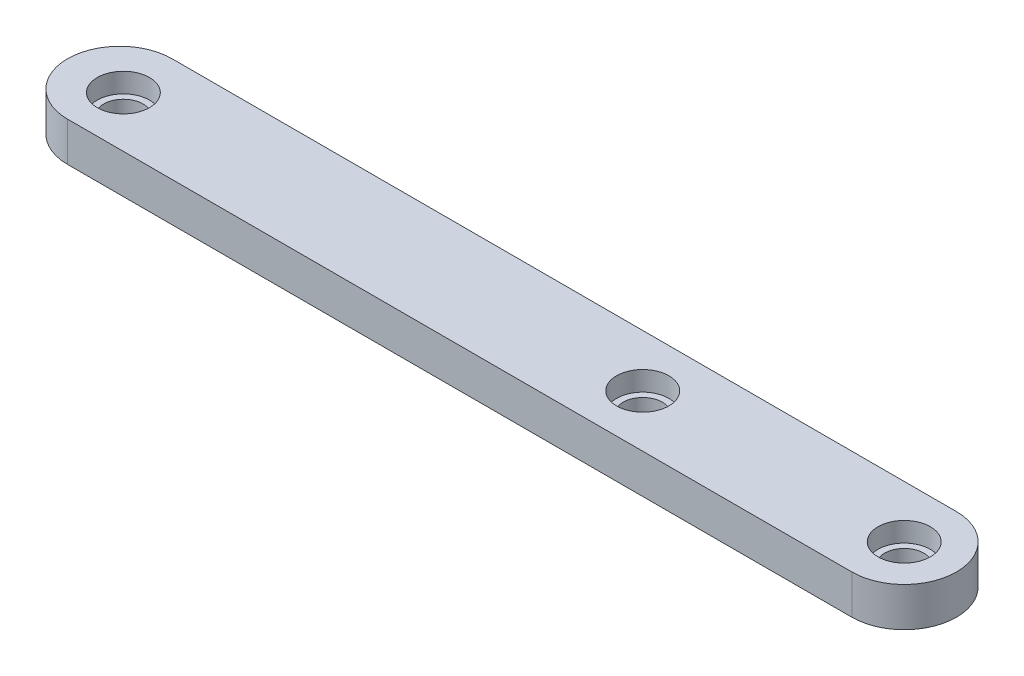
ISO-10303-21;
HEADER;
FILE_DESCRIPTION(('STEP AP214'),'2;1');
FILE_NAME('part.step','',(''),(''),'','','');
FILE_SCHEMA(('AUTOMOTIVE_DESIGN { 1 0 10303 214 1 1 1 1 }'));
ENDSEC;
DATA;
#1=APPLICATION_CONTEXT('core data for automotive mechanical design processes');
#2=APPLICATION_PROTOCOL_DEFINITION('international standard','automotive_design',2000,#1);
#3=PRODUCT_CONTEXT('',#1,'mechanical');
#4=PRODUCT('Part','Part','',(#3));
#5=PRODUCT_RELATED_PRODUCT_CATEGORY('part','',(#4));
#6=PRODUCT_DEFINITION_FORMATION('','',#4);
#7=PRODUCT_DEFINITION_CONTEXT('part definition',#1,'design');
#8=PRODUCT_DEFINITION('design','',#6,#7);
#9=PRODUCT_DEFINITION_SHAPE('','',#8);
#10=(LENGTH_UNIT() NAMED_UNIT(*) SI_UNIT(.MILLI.,.METRE.));
#11=(NAMED_UNIT(*) PLANE_ANGLE_UNIT() SI_UNIT($,.RADIAN.));
#12=(NAMED_UNIT(*) SI_UNIT($,.STERADIAN.) SOLID_ANGLE_UNIT());
#13=UNCERTAINTY_MEASURE_WITH_UNIT(LENGTH_MEASURE(1.E-05),#10,'distance_accuracy_value','');
#14=(GEOMETRIC_REPRESENTATION_CONTEXT(3) GLOBAL_UNCERTAINTY_ASSIGNED_CONTEXT((#13)) GLOBAL_UNIT_ASSIGNED_CONTEXT((#10,
#11,#12)) REPRESENTATION_CONTEXT('',''));
#15=CARTESIAN_POINT('',(0.,0.,0.));
#16=DIRECTION('',(0.,0.,1.));
#17=DIRECTION('',(1.,0.,0.));
#18=AXIS2_PLACEMENT_3D('',#15,#16,#17);
#19=CARTESIAN_POINT('',(-59.243309236767,6.,0.211557175716284));
#20=DIRECTION('',(0.,-1.,0.));
#21=DIRECTION('',(0.,0.,-1.));
#22=AXIS2_PLACEMENT_3D('',#19,#20,#21);
#23=CYLINDRICAL_SURFACE('',#22,3.);
#24=CARTESIAN_POINT('',(-59.243309236767,0.,0.211557175716284));
#25=DIRECTION('',(0.,1.,0.));
#26=DIRECTION('',(0.,0.,1.));
#27=AXIS2_PLACEMENT_3D('',#24,#25,#26);
#28=CIRCLE('',#27,3.);
#29=CARTESIAN_POINT('',(-59.243309236767,0.,3.21155717571629));
#30=VERTEX_POINT('',#29);
#31=EDGE_CURVE('E115',#30,#30,#28,.T.);
#32=ORIENTED_EDGE('',*,*,#31,.F.);
#33=EDGE_LOOP('',(#32));
#34=FACE_BOUND('',#33,.T.);
#35=CARTESIAN_POINT('',(-59.243309236767,3.,0.211557175716284));
#36=DIRECTION('',(0.,1.,0.));
#37=DIRECTION('',(0.,0.,1.));
#38=AXIS2_PLACEMENT_3D('',#35,#36,#37);
#39=CIRCLE('',#38,3.);
#40=CARTESIAN_POINT('',(-59.243309236767,3.,3.21155717571629));
#41=VERTEX_POINT('',#40);
#42=EDGE_CURVE('E43',#41,#41,#39,.T.);
#43=ORIENTED_EDGE('',*,*,#42,.T.);
#44=EDGE_LOOP('',(#43));
#45=FACE_BOUND('',#44,.T.);
#46=ADVANCED_FACE('F39',(#34,#45),#23,.F.);
#47=CARTESIAN_POINT('',(60.,6.,0.));
#48=DIRECTION('',(0.,-1.,0.));
#49=DIRECTION('',(0.,0.,-1.));
#50=AXIS2_PLACEMENT_3D('',#47,#48,#49);
#51=CYLINDRICAL_SURFACE('',#50,3.00000000000001);
#52=CARTESIAN_POINT('',(60.,0.,0.));
#53=DIRECTION('',(0.,1.,0.));
#54=DIRECTION('',(0.,0.,1.));
#55=AXIS2_PLACEMENT_3D('',#52,#53,#54);
#56=CIRCLE('',#55,3.00000000000001);
#57=CARTESIAN_POINT('',(60.,0.,3.00000000000001));
#58=VERTEX_POINT('',#57);
#59=EDGE_CURVE('E142',#58,#58,#56,.T.);
#60=ORIENTED_EDGE('',*,*,#59,.F.);
#61=EDGE_LOOP('',(#60));
#62=FACE_BOUND('',#61,.T.);
#63=CARTESIAN_POINT('',(60.,3.,0.));
#64=DIRECTION('',(0.,1.,0.));
#65=DIRECTION('',(0.,0.,1.));
#66=AXIS2_PLACEMENT_3D('',#63,#64,#65);
#67=CIRCLE('',#66,3.00000000000001);
#68=CARTESIAN_POINT('',(60.,3.,3.00000000000001));
#69=VERTEX_POINT('',#68);
#70=EDGE_CURVE('E129',#69,#69,#67,.T.);
#71=ORIENTED_EDGE('',*,*,#70,.T.);
#72=EDGE_LOOP('',(#71));
#73=FACE_BOUND('',#72,.T.);
#74=ADVANCED_FACE('F162',(#62,#73),#51,.F.);
#75=CARTESIAN_POINT('',(20.,6.,0.));
#76=DIRECTION('',(0.,-1.,0.));
#77=DIRECTION('',(0.,0.,-1.));
#78=AXIS2_PLACEMENT_3D('',#75,#76,#77);
#79=CYLINDRICAL_SURFACE('',#78,3.);
#80=CARTESIAN_POINT('',(20.,0.,0.));
#81=DIRECTION('',(0.,1.,0.));
#82=DIRECTION('',(0.,0.,1.));
#83=AXIS2_PLACEMENT_3D('',#80,#81,#82);
#84=CIRCLE('',#83,3.);
#85=CARTESIAN_POINT('',(20.,0.,3.));
#86=VERTEX_POINT('',#85);
#87=EDGE_CURVE('E137',#86,#86,#84,.T.);
#88=ORIENTED_EDGE('',*,*,#87,.F.);
#89=EDGE_LOOP('',(#88));
#90=FACE_BOUND('',#89,.T.);
#91=CARTESIAN_POINT('',(20.,3.,0.));
#92=DIRECTION('',(0.,1.,0.));
#93=DIRECTION('',(0.,0.,1.));
#94=AXIS2_PLACEMENT_3D('',#91,#92,#93);
#95=CIRCLE('',#94,3.);
#96=CARTESIAN_POINT('',(20.,3.,3.));
#97=VERTEX_POINT('',#96);
#98=EDGE_CURVE('E126',#97,#97,#95,.T.);
#99=ORIENTED_EDGE('',*,*,#98,.T.);
#100=EDGE_LOOP('',(#99));
#101=FACE_BOUND('',#100,.T.);
#102=ADVANCED_FACE('F167',(#90,#101),#79,.F.);
#103=CARTESIAN_POINT('',(60.,6.,0.));
#104=DIRECTION('',(0.,1.,0.));
#105=DIRECTION('',(0.,0.,1.));
#106=AXIS2_PLACEMENT_3D('',#103,#104,#105);
#107=PLANE('',#106);
#108=CARTESIAN_POINT('',(-59.243309236767,6.,0.211557175716284));
#109=DIRECTION('',(0.,1.,0.));
#110=DIRECTION('',(0.,0.,1.));
#111=AXIS2_PLACEMENT_3D('',#108,#109,#110);
#112=CIRCLE('',#111,4.);
#113=CARTESIAN_POINT('',(-59.243309236767,6.,4.21155717571628));
#114=VERTEX_POINT('',#113);
#115=EDGE_CURVE('E302',#114,#114,#112,.T.);
#116=ORIENTED_EDGE('',*,*,#115,.F.);
#117=EDGE_LOOP('',(#116));
#118=FACE_BOUND('',#117,.T.);
#119=CARTESIAN_POINT('',(20.,6.,0.));
#120=DIRECTION('',(0.,1.,0.));
#121=DIRECTION('',(0.,0.,1.));
#122=AXIS2_PLACEMENT_3D('',#119,#120,#121);
#123=CIRCLE('',#122,4.);
#124=CARTESIAN_POINT('',(20.,6.,4.));
#125=VERTEX_POINT('',#124);
#126=EDGE_CURVE('E312',#125,#125,#123,.T.);
#127=ORIENTED_EDGE('',*,*,#126,.F.);
#128=EDGE_LOOP('',(#127));
#129=FACE_BOUND('',#128,.T.);
#130=CARTESIAN_POINT('',(60.,6.,0.));
#131=DIRECTION('',(0.,1.,0.));
#132=DIRECTION('',(0.,0.,1.));
#133=AXIS2_PLACEMENT_3D('',#130,#131,#132);
#134=CIRCLE('',#133,4.00000000000001);
#135=CARTESIAN_POINT('',(60.,6.,4.00000000000001));
#136=VERTEX_POINT('',#135);
#137=EDGE_CURVE('E150',#136,#136,#134,.T.);
#138=ORIENTED_EDGE('',*,*,#137,.F.);
#139=EDGE_LOOP('',(#138));
#140=FACE_BOUND('',#139,.T.);
#141=CARTESIAN_POINT('',(60.,6.,0.));
#142=DIRECTION('',(0.,1.,0.));
#143=DIRECTION('',(0.,0.,1.));
#144=AXIS2_PLACEMENT_3D('',#141,#142,#143);
#145=CIRCLE('',#144,8.);
#146=CARTESIAN_POINT('',(60.,6.,8.));
#147=VERTEX_POINT('',#146);
#148=CARTESIAN_POINT('',(60.,6.,-8.));
#149=VERTEX_POINT('',#148);
#150=EDGE_CURVE('E94',#147,#149,#145,.T.);
#151=ORIENTED_EDGE('',*,*,#150,.T.);
#152=DIRECTION('',(-1.,0.,0.));
#153=VECTOR('',#152,1.);
#154=CARTESIAN_POINT('',(-60.,6.,-8.));
#155=LINE('',#154,#153);
#156=CARTESIAN_POINT('',(-60.,6.,-8.));
#157=VERTEX_POINT('',#156);
#158=EDGE_CURVE('E89',#149,#157,#155,.T.);
#159=ORIENTED_EDGE('',*,*,#158,.T.);
#160=CARTESIAN_POINT('',(-60.,6.,0.));
#161=DIRECTION('',(0.,1.,0.));
#162=DIRECTION('',(0.,0.,1.));
#163=AXIS2_PLACEMENT_3D('',#160,#161,#162);
#164=CIRCLE('',#163,8.);
#165=CARTESIAN_POINT('',(-60.,6.,8.));
#166=VERTEX_POINT('',#165);
#167=EDGE_CURVE('E92',#157,#166,#164,.T.);
#168=ORIENTED_EDGE('',*,*,#167,.T.);
#169=DIRECTION('',(1.,0.,0.));
#170=VECTOR('',#169,1.);
#171=CARTESIAN_POINT('',(-60.,6.,8.));
#172=LINE('',#171,#170);
#173=EDGE_CURVE('E59',#166,#147,#172,.T.);
#174=ORIENTED_EDGE('',*,*,#173,.T.);
#175=EDGE_LOOP('',(#151,#159,#168,#174));
#176=FACE_BOUND('',#175,.T.);
#177=ADVANCED_FACE('F90',(#118,#129,#140,#176),#107,.T.);
#178=CARTESIAN_POINT('',(60.,0.,0.));
#179=DIRECTION('',(0.,1.,0.));
#180=DIRECTION('',(0.,0.,1.));
#181=AXIS2_PLACEMENT_3D('',#178,#179,#180);
#182=PLANE('',#181);
#183=CARTESIAN_POINT('',(60.,0.,0.));
#184=DIRECTION('',(0.,1.,0.));
#185=DIRECTION('',(0.,0.,1.));
#186=AXIS2_PLACEMENT_3D('',#183,#184,#185);
#187=CIRCLE('',#186,8.);
#188=CARTESIAN_POINT('',(60.,0.,8.));
#189=VERTEX_POINT('',#188);
#190=CARTESIAN_POINT('',(60.,0.,-8.));
#191=VERTEX_POINT('',#190);
#192=EDGE_CURVE('E111',#189,#191,#187,.T.);
#193=ORIENTED_EDGE('',*,*,#192,.F.);
#194=DIRECTION('',(1.,0.,0.));
#195=VECTOR('',#194,1.);
#196=CARTESIAN_POINT('',(-60.,0.,8.));
#197=LINE('',#196,#195);
#198=CARTESIAN_POINT('',(-60.,0.,8.));
#199=VERTEX_POINT('',#198);
#200=EDGE_CURVE('E82',#199,#189,#197,.T.);
#201=ORIENTED_EDGE('',*,*,#200,.F.);
#202=CARTESIAN_POINT('',(-60.,0.,0.));
#203=DIRECTION('',(0.,1.,0.));
#204=DIRECTION('',(0.,0.,1.));
#205=AXIS2_PLACEMENT_3D('',#202,#203,#204);
#206=CIRCLE('',#205,8.);
#207=CARTESIAN_POINT('',(-60.,0.,-8.));
#208=VERTEX_POINT('',#207);
#209=EDGE_CURVE('E76',#208,#199,#206,.T.);
#210=ORIENTED_EDGE('',*,*,#209,.F.);
#211=DIRECTION('',(-1.,0.,0.));
#212=VECTOR('',#211,1.);
#213=CARTESIAN_POINT('',(-60.,0.,-8.));
#214=LINE('',#213,#212);
#215=EDGE_CURVE('E99',#191,#208,#214,.T.);
#216=ORIENTED_EDGE('',*,*,#215,.F.);
#217=EDGE_LOOP('',(#193,#201,#210,#216));
#218=FACE_BOUND('',#217,.T.);
#219=ORIENTED_EDGE('',*,*,#31,.T.);
#220=EDGE_LOOP('',(#219));
#221=FACE_BOUND('',#220,.T.);
#222=ORIENTED_EDGE('',*,*,#59,.T.);
#223=EDGE_LOOP('',(#222));
#224=FACE_BOUND('',#223,.T.);
#225=ORIENTED_EDGE('',*,*,#87,.T.);
#226=EDGE_LOOP('',(#225));
#227=FACE_BOUND('',#226,.T.);
#228=ADVANCED_FACE('F158',(#218,#221,#224,#227),#182,.F.);
#229=CARTESIAN_POINT('',(60.,6.,0.));
#230=DIRECTION('',(0.,-1.,0.));
#231=DIRECTION('',(0.,0.,-1.));
#232=AXIS2_PLACEMENT_3D('',#229,#230,#231);
#233=CYLINDRICAL_SURFACE('',#232,8.);
#234=ORIENTED_EDGE('',*,*,#192,.T.);
#235=DIRECTION('',(0.,-1.,0.));
#236=VECTOR('',#235,1.);
#237=CARTESIAN_POINT('',(60.,6.,-8.));
#238=LINE('',#237,#236);
#239=EDGE_CURVE('E11',#149,#191,#238,.T.);
#240=ORIENTED_EDGE('',*,*,#239,.F.);
#241=ORIENTED_EDGE('',*,*,#150,.F.);
#242=DIRECTION('',(0.,-1.,0.));
#243=VECTOR('',#242,1.);
#244=CARTESIAN_POINT('',(60.,6.,8.));
#245=LINE('',#244,#243);
#246=EDGE_CURVE('E107',#147,#189,#245,.T.);
#247=ORIENTED_EDGE('',*,*,#246,.T.);
#248=EDGE_LOOP('',(#234,#240,#241,#247));
#249=FACE_BOUND('',#248,.T.);
#250=ADVANCED_FACE('F41',(#249),#233,.T.);
#251=CARTESIAN_POINT('',(-60.,6.,-8.));
#252=DIRECTION('',(0.,0.,1.));
#253=DIRECTION('',(1.,0.,0.));
#254=AXIS2_PLACEMENT_3D('',#251,#252,#253);
#255=PLANE('',#254);
#256=ORIENTED_EDGE('',*,*,#215,.T.);
#257=DIRECTION('',(0.,-1.,0.));
#258=VECTOR('',#257,1.);
#259=CARTESIAN_POINT('',(-60.,6.,-8.));
#260=LINE('',#259,#258);
#261=EDGE_CURVE('E50',#157,#208,#260,.T.);
#262=ORIENTED_EDGE('',*,*,#261,.F.);
#263=ORIENTED_EDGE('',*,*,#158,.F.);
#264=ORIENTED_EDGE('',*,*,#239,.T.);
#265=EDGE_LOOP('',(#256,#262,#263,#264));
#266=FACE_BOUND('',#265,.T.);
#267=ADVANCED_FACE('F98',(#266),#255,.F.);
#268=CARTESIAN_POINT('',(-60.,6.,0.));
#269=DIRECTION('',(0.,-1.,0.));
#270=DIRECTION('',(0.,0.,-1.));
#271=AXIS2_PLACEMENT_3D('',#268,#269,#270);
#272=CYLINDRICAL_SURFACE('',#271,8.);
#273=ORIENTED_EDGE('',*,*,#209,.T.);
#274=DIRECTION('',(0.,-1.,0.));
#275=VECTOR('',#274,1.);
#276=CARTESIAN_POINT('',(-60.,6.,8.));
#277=LINE('',#276,#275);
#278=EDGE_CURVE('E101',#166,#199,#277,.T.);
#279=ORIENTED_EDGE('',*,*,#278,.F.);
#280=ORIENTED_EDGE('',*,*,#167,.F.);
#281=ORIENTED_EDGE('',*,*,#261,.T.);
#282=EDGE_LOOP('',(#273,#279,#280,#281));
#283=FACE_BOUND('',#282,.T.);
#284=ADVANCED_FACE('F103',(#283),#272,.T.);
#285=CARTESIAN_POINT('',(-60.,6.,8.));
#286=DIRECTION('',(0.,0.,-1.));
#287=DIRECTION('',(-1.,0.,0.));
#288=AXIS2_PLACEMENT_3D('',#285,#286,#287);
#289=PLANE('',#288);
#290=ORIENTED_EDGE('',*,*,#200,.T.);
#291=ORIENTED_EDGE('',*,*,#246,.F.);
#292=ORIENTED_EDGE('',*,*,#173,.F.);
#293=ORIENTED_EDGE('',*,*,#278,.T.);
#294=EDGE_LOOP('',(#290,#291,#292,#293));
#295=FACE_BOUND('',#294,.T.);
#296=ADVANCED_FACE('F178',(#295),#289,.F.);
#297=CARTESIAN_POINT('',(20.,3.,0.));
#298=DIRECTION('',(0.,1.,0.));
#299=DIRECTION('',(0.,0.,1.));
#300=AXIS2_PLACEMENT_3D('',#297,#298,#299);
#301=CYLINDRICAL_SURFACE('',#300,4.);
#302=CARTESIAN_POINT('',(20.,3.,0.));
#303=DIRECTION('',(0.,1.,0.));
#304=DIRECTION('',(0.,0.,1.));
#305=AXIS2_PLACEMENT_3D('',#302,#303,#304);
#306=CIRCLE('',#305,4.);
#307=CARTESIAN_POINT('',(20.,3.,4.));
#308=VERTEX_POINT('',#307);
#309=EDGE_CURVE('E306',#308,#308,#306,.T.);
#310=ORIENTED_EDGE('',*,*,#309,.F.);
#311=EDGE_LOOP('',(#310));
#312=FACE_BOUND('',#311,.T.);
#313=ORIENTED_EDGE('',*,*,#126,.T.);
#314=EDGE_LOOP('',(#313));
#315=FACE_BOUND('',#314,.T.);
#316=ADVANCED_FACE('F181',(#312,#315),#301,.F.);
#317=CARTESIAN_POINT('',(20.,3.,0.));
#318=DIRECTION('',(0.,1.,0.));
#319=DIRECTION('',(0.,0.,1.));
#320=AXIS2_PLACEMENT_3D('',#317,#318,#319);
#321=PLANE('',#320);
#322=ORIENTED_EDGE('',*,*,#98,.F.);
#323=EDGE_LOOP('',(#322));
#324=FACE_BOUND('',#323,.T.);
#325=ORIENTED_EDGE('',*,*,#309,.T.);
#326=EDGE_LOOP('',(#325));
#327=FACE_BOUND('',#326,.T.);
#328=ADVANCED_FACE('F244',(#324,#327),#321,.T.);
#329=CARTESIAN_POINT('',(60.,3.,0.));
#330=DIRECTION('',(0.,1.,0.));
#331=DIRECTION('',(0.,0.,1.));
#332=AXIS2_PLACEMENT_3D('',#329,#330,#331);
#333=CYLINDRICAL_SURFACE('',#332,4.00000000000001);
#334=CARTESIAN_POINT('',(60.,3.,0.));
#335=DIRECTION('',(0.,1.,0.));
#336=DIRECTION('',(0.,0.,1.));
#337=AXIS2_PLACEMENT_3D('',#334,#335,#336);
#338=CIRCLE('',#337,4.00000000000001);
#339=CARTESIAN_POINT('',(60.,3.,4.00000000000001));
#340=VERTEX_POINT('',#339);
#341=EDGE_CURVE('E315',#340,#340,#338,.T.);
#342=ORIENTED_EDGE('',*,*,#341,.F.);
#343=EDGE_LOOP('',(#342));
#344=FACE_BOUND('',#343,.T.);
#345=ORIENTED_EDGE('',*,*,#137,.T.);
#346=EDGE_LOOP('',(#345));
#347=FACE_BOUND('',#346,.T.);
#348=ADVANCED_FACE('F251',(#344,#347),#333,.F.);
#349=CARTESIAN_POINT('',(60.,3.,0.));
#350=DIRECTION('',(0.,1.,0.));
#351=DIRECTION('',(0.,0.,1.));
#352=AXIS2_PLACEMENT_3D('',#349,#350,#351);
#353=PLANE('',#352);
#354=ORIENTED_EDGE('',*,*,#70,.F.);
#355=EDGE_LOOP('',(#354));
#356=FACE_BOUND('',#355,.T.);
#357=ORIENTED_EDGE('',*,*,#341,.T.);
#358=EDGE_LOOP('',(#357));
#359=FACE_BOUND('',#358,.T.);
#360=ADVANCED_FACE('F259',(#356,#359),#353,.T.);
#361=CARTESIAN_POINT('',(-59.243309236767,3.,0.211557175716284));
#362=DIRECTION('',(0.,1.,0.));
#363=DIRECTION('',(0.,0.,1.));
#364=AXIS2_PLACEMENT_3D('',#361,#362,#363);
#365=CYLINDRICAL_SURFACE('',#364,4.);
#366=CARTESIAN_POINT('',(-59.243309236767,3.,0.211557175716284));
#367=DIRECTION('',(0.,1.,0.));
#368=DIRECTION('',(0.,0.,1.));
#369=AXIS2_PLACEMENT_3D('',#366,#367,#368);
#370=CIRCLE('',#369,4.);
#371=CARTESIAN_POINT('',(-59.243309236767,3.,4.21155717571628));
#372=VERTEX_POINT('',#371);
#373=EDGE_CURVE('E130',#372,#372,#370,.T.);
#374=ORIENTED_EDGE('',*,*,#373,.F.);
#375=EDGE_LOOP('',(#374));
#376=FACE_BOUND('',#375,.T.);
#377=ORIENTED_EDGE('',*,*,#115,.T.);
#378=EDGE_LOOP('',(#377));
#379=FACE_BOUND('',#378,.T.);
#380=ADVANCED_FACE('F267',(#376,#379),#365,.F.);
#381=CARTESIAN_POINT('',(-59.243309236767,3.,0.211557175716284));
#382=DIRECTION('',(0.,1.,0.));
#383=DIRECTION('',(0.,0.,1.));
#384=AXIS2_PLACEMENT_3D('',#381,#382,#383);
#385=PLANE('',#384);
#386=ORIENTED_EDGE('',*,*,#42,.F.);
#387=EDGE_LOOP('',(#386));
#388=FACE_BOUND('',#387,.T.);
#389=ORIENTED_EDGE('',*,*,#373,.T.);
#390=EDGE_LOOP('',(#389));
#391=FACE_BOUND('',#390,.T.);
#392=ADVANCED_FACE('F275',(#388,#391),#385,.T.);
#393=CLOSED_SHELL('',(#46,#74,#102,#177,#228,#250,#267,#284,#296,#316,#328,#348,#360,#380,#392));
#394=MANIFOLD_SOLID_BREP('B2',#393);
#395=ADVANCED_BREP_SHAPE_REPRESENTATION('',(#18,#394),#14);
#396=SHAPE_DEFINITION_REPRESENTATION(#9,#395);
ENDSEC;
END-ISO-10303-21;
